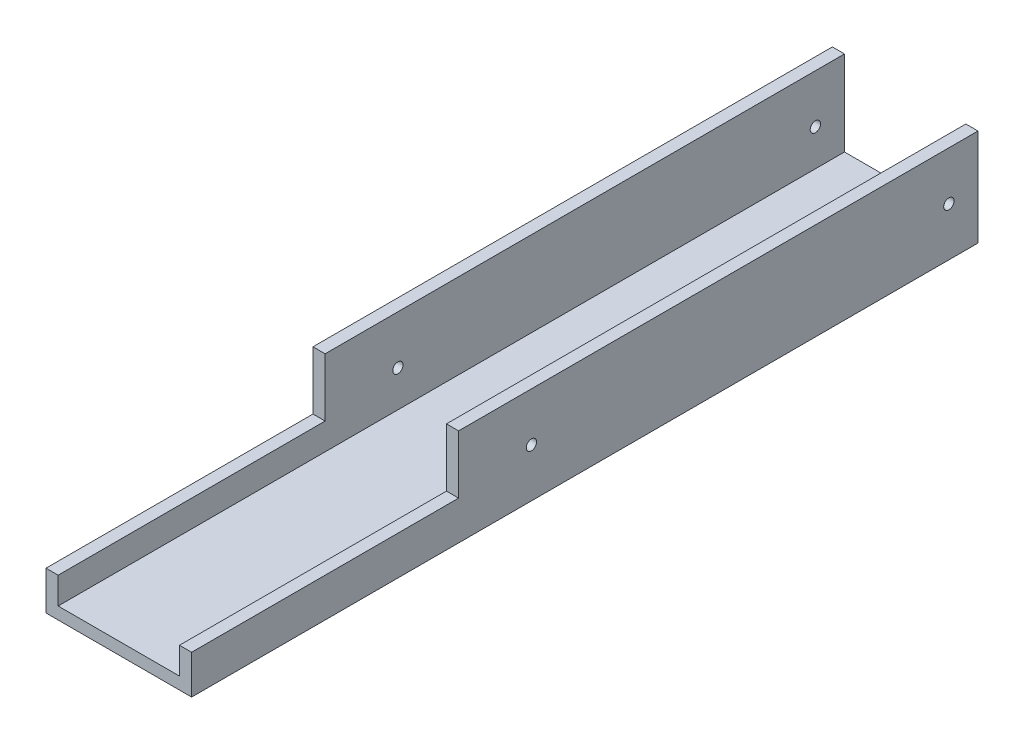
ISO-10303-21;
HEADER;
FILE_DESCRIPTION(('STEP AP214'),'2;1');
FILE_NAME('part.step','',(''),(''),'','','');
FILE_SCHEMA(('AUTOMOTIVE_DESIGN { 1 0 10303 214 1 1 1 1 }'));
ENDSEC;
DATA;
#1=APPLICATION_CONTEXT('core data for automotive mechanical design processes');
#2=APPLICATION_PROTOCOL_DEFINITION('international standard','automotive_design',2000,#1);
#3=PRODUCT_CONTEXT('',#1,'mechanical');
#4=PRODUCT('Part','Part','',(#3));
#5=PRODUCT_RELATED_PRODUCT_CATEGORY('part','',(#4));
#6=PRODUCT_DEFINITION_FORMATION('','',#4);
#7=PRODUCT_DEFINITION_CONTEXT('part definition',#1,'design');
#8=PRODUCT_DEFINITION('design','',#6,#7);
#9=PRODUCT_DEFINITION_SHAPE('','',#8);
#10=(LENGTH_UNIT() NAMED_UNIT(*) SI_UNIT(.MILLI.,.METRE.));
#11=(NAMED_UNIT(*) PLANE_ANGLE_UNIT() SI_UNIT($,.RADIAN.));
#12=(NAMED_UNIT(*) SI_UNIT($,.STERADIAN.) SOLID_ANGLE_UNIT());
#13=UNCERTAINTY_MEASURE_WITH_UNIT(LENGTH_MEASURE(1.E-05),#10,'distance_accuracy_value','');
#14=(GEOMETRIC_REPRESENTATION_CONTEXT(3) GLOBAL_UNCERTAINTY_ASSIGNED_CONTEXT((#13)) GLOBAL_UNIT_ASSIGNED_CONTEXT((#10,
#11,#12)) REPRESENTATION_CONTEXT('',''));
#15=CARTESIAN_POINT('',(0.,0.,0.));
#16=DIRECTION('',(0.,0.,1.));
#17=DIRECTION('',(1.,0.,0.));
#18=AXIS2_PLACEMENT_3D('',#15,#16,#17);
#19=CARTESIAN_POINT('',(-15.875,12.7,609.6));
#20=DIRECTION('',(0.,-1.,0.));
#21=DIRECTION('',(0.,0.,-1.));
#22=AXIS2_PLACEMENT_3D('',#19,#20,#21);
#23=PLANE('',#22);
#24=DIRECTION('',(0.,0.,-1.));
#25=VECTOR('',#24,1.);
#26=CARTESIAN_POINT('',(-19.05,12.7,609.6));
#27=LINE('',#26,#25);
#28=CARTESIAN_POINT('',(-19.05,12.7,-473.71));
#29=VERTEX_POINT('',#28);
#30=CARTESIAN_POINT('',(-19.05,12.7,-609.6));
#31=VERTEX_POINT('',#30);
#32=EDGE_CURVE('E175',#29,#31,#27,.T.);
#33=ORIENTED_EDGE('',*,*,#32,.F.);
#34=DIRECTION('',(-1.,0.,0.));
#35=VECTOR('',#34,1.);
#36=CARTESIAN_POINT('',(19.05,12.7,-473.71));
#37=LINE('',#36,#35);
#38=CARTESIAN_POINT('',(-15.875,12.7,-473.71));
#39=VERTEX_POINT('',#38);
#40=EDGE_CURVE('E156',#39,#29,#37,.T.);
#41=ORIENTED_EDGE('',*,*,#40,.F.);
#42=DIRECTION('',(0.,0.,-1.));
#43=VECTOR('',#42,1.);
#44=CARTESIAN_POINT('',(-15.875,12.7,609.6));
#45=LINE('',#44,#43);
#46=CARTESIAN_POINT('',(-15.875,12.7,-609.6));
#47=VERTEX_POINT('',#46);
#48=EDGE_CURVE('E250',#39,#47,#45,.T.);
#49=ORIENTED_EDGE('',*,*,#48,.T.);
#50=DIRECTION('',(-1.,0.,0.));
#51=VECTOR('',#50,1.);
#52=CARTESIAN_POINT('',(-15.875,12.7,-609.6));
#53=LINE('',#52,#51);
#54=EDGE_CURVE('E222',#47,#31,#53,.T.);
#55=ORIENTED_EDGE('',*,*,#54,.T.);
#56=EDGE_LOOP('',(#33,#41,#49,#55));
#57=FACE_BOUND('',#56,.T.);
#58=ADVANCED_FACE('F44',(#57),#23,.F.);
#59=CARTESIAN_POINT('',(-19.05,12.7,609.6));
#60=DIRECTION('',(1.,0.,0.));
#61=DIRECTION('',(0.,1.,0.));
#62=AXIS2_PLACEMENT_3D('',#59,#60,#61);
#63=PLANE('',#62);
#64=CARTESIAN_POINT('',(-19.05,0.,-492.76));
#65=DIRECTION('',(-1.,0.,0.));
#66=DIRECTION('',(0.,0.,1.));
#67=AXIS2_PLACEMENT_3D('',#64,#65,#66);
#68=CIRCLE('',#67,1.35255);
#69=CARTESIAN_POINT('',(-19.05,0.,-491.40745));
#70=VERTEX_POINT('',#69);
#71=EDGE_CURVE('E293',#70,#70,#68,.T.);
#72=ORIENTED_EDGE('',*,*,#71,.F.);
#73=EDGE_LOOP('',(#72));
#74=FACE_BOUND('',#73,.T.);
#75=CARTESIAN_POINT('',(-19.05,0.,-601.98));
#76=DIRECTION('',(-1.,0.,0.));
#77=DIRECTION('',(0.,0.,1.));
#78=AXIS2_PLACEMENT_3D('',#75,#76,#77);
#79=CIRCLE('',#78,1.35254999999999);
#80=CARTESIAN_POINT('',(-19.05,0.,-600.62745));
#81=VERTEX_POINT('',#80);
#82=EDGE_CURVE('E303',#81,#81,#79,.T.);
#83=ORIENTED_EDGE('',*,*,#82,.F.);
#84=EDGE_LOOP('',(#83));
#85=FACE_BOUND('',#84,.T.);
#86=DIRECTION('',(0.,-1.,0.));
#87=VECTOR('',#86,1.);
#88=CARTESIAN_POINT('',(-19.05,-12.7,-403.86));
#89=LINE('',#88,#87);
#90=CARTESIAN_POINT('',(-19.05,-2.54,-403.86));
#91=VERTEX_POINT('',#90);
#92=CARTESIAN_POINT('',(-19.05,-12.7,-403.86));
#93=VERTEX_POINT('',#92);
#94=EDGE_CURVE('E189',#91,#93,#89,.T.);
#95=ORIENTED_EDGE('',*,*,#94,.F.);
#96=DIRECTION('',(0.,0.,-1.));
#97=VECTOR('',#96,1.);
#98=CARTESIAN_POINT('',(-19.05,-2.53999999999988,609.6));
#99=LINE('',#98,#97);
#100=CARTESIAN_POINT('',(-19.05,-2.54000000000002,-473.71));
#101=VERTEX_POINT('',#100);
#102=EDGE_CURVE('E67',#91,#101,#99,.T.);
#103=ORIENTED_EDGE('',*,*,#102,.T.);
#104=DIRECTION('',(0.,1.,0.));
#105=VECTOR('',#104,1.);
#106=CARTESIAN_POINT('',(-19.05,12.7,-473.71));
#107=LINE('',#106,#105);
#108=EDGE_CURVE('E290',#101,#29,#107,.T.);
#109=ORIENTED_EDGE('',*,*,#108,.T.);
#110=ORIENTED_EDGE('',*,*,#32,.T.);
#111=DIRECTION('',(0.,-1.,0.));
#112=VECTOR('',#111,1.);
#113=CARTESIAN_POINT('',(-19.05,12.7,-609.6));
#114=LINE('',#113,#112);
#115=CARTESIAN_POINT('',(-19.05,-12.7,-609.6));
#116=VERTEX_POINT('',#115);
#117=EDGE_CURVE('E226',#31,#116,#114,.T.);
#118=ORIENTED_EDGE('',*,*,#117,.T.);
#119=DIRECTION('',(0.,0.,-1.));
#120=VECTOR('',#119,1.);
#121=CARTESIAN_POINT('',(-19.05,-12.7,609.6));
#122=LINE('',#121,#120);
#123=EDGE_CURVE('E167',#93,#116,#122,.T.);
#124=ORIENTED_EDGE('',*,*,#123,.F.);
#125=EDGE_LOOP('',(#95,#103,#109,#110,#118,#124));
#126=FACE_BOUND('',#125,.T.);
#127=ADVANCED_FACE('F196',(#74,#85,#126),#63,.F.);
#128=CARTESIAN_POINT('',(-19.05,-12.7,609.6));
#129=DIRECTION('',(0.,1.,0.));
#130=DIRECTION('',(0.,0.,1.));
#131=AXIS2_PLACEMENT_3D('',#128,#129,#130);
#132=PLANE('',#131);
#133=DIRECTION('',(0.,0.,-1.));
#134=VECTOR('',#133,1.);
#135=CARTESIAN_POINT('',(19.05,-12.7,609.6));
#136=LINE('',#135,#134);
#137=CARTESIAN_POINT('',(19.05,-12.7,-403.86));
#138=VERTEX_POINT('',#137);
#139=CARTESIAN_POINT('',(19.05,-12.7,-609.6));
#140=VERTEX_POINT('',#139);
#141=EDGE_CURVE('E163',#138,#140,#136,.T.);
#142=ORIENTED_EDGE('',*,*,#141,.F.);
#143=DIRECTION('',(1.,0.,0.));
#144=VECTOR('',#143,1.);
#145=CARTESIAN_POINT('',(19.05,-12.7,-403.86));
#146=LINE('',#145,#144);
#147=EDGE_CURVE('E200',#93,#138,#146,.T.);
#148=ORIENTED_EDGE('',*,*,#147,.F.);
#149=ORIENTED_EDGE('',*,*,#123,.T.);
#150=DIRECTION('',(1.,0.,0.));
#151=VECTOR('',#150,1.);
#152=CARTESIAN_POINT('',(-19.05,-12.7,-609.6));
#153=LINE('',#152,#151);
#154=EDGE_CURVE('E229',#116,#140,#153,.T.);
#155=ORIENTED_EDGE('',*,*,#154,.T.);
#156=EDGE_LOOP('',(#142,#148,#149,#155));
#157=FACE_BOUND('',#156,.T.);
#158=ADVANCED_FACE('F336',(#157),#132,.F.);
#159=CARTESIAN_POINT('',(19.05,-12.7,609.6));
#160=DIRECTION('',(-1.,0.,0.));
#161=DIRECTION('',(0.,-1.,0.));
#162=AXIS2_PLACEMENT_3D('',#159,#160,#161);
#163=PLANE('',#162);
#164=CARTESIAN_POINT('',(19.05,0.,-492.76));
#165=DIRECTION('',(-1.,0.,0.));
#166=DIRECTION('',(0.,0.,1.));
#167=AXIS2_PLACEMENT_3D('',#164,#165,#166);
#168=CIRCLE('',#167,1.35254999999999);
#169=CARTESIAN_POINT('',(19.05,0.,-491.40745));
#170=VERTEX_POINT('',#169);
#171=EDGE_CURVE('E182',#170,#170,#168,.T.);
#172=ORIENTED_EDGE('',*,*,#171,.T.);
#173=EDGE_LOOP('',(#172));
#174=FACE_BOUND('',#173,.T.);
#175=CARTESIAN_POINT('',(19.05,0.,-601.98));
#176=DIRECTION('',(-1.,0.,0.));
#177=DIRECTION('',(0.,0.,1.));
#178=AXIS2_PLACEMENT_3D('',#175,#176,#177);
#179=CIRCLE('',#178,1.35254999999999);
#180=CARTESIAN_POINT('',(19.05,0.,-600.62745));
#181=VERTEX_POINT('',#180);
#182=EDGE_CURVE('E307',#181,#181,#179,.T.);
#183=ORIENTED_EDGE('',*,*,#182,.T.);
#184=EDGE_LOOP('',(#183));
#185=FACE_BOUND('',#184,.T.);
#186=DIRECTION('',(0.,-1.,0.));
#187=VECTOR('',#186,1.);
#188=CARTESIAN_POINT('',(19.05,12.7,-473.71));
#189=LINE('',#188,#187);
#190=CARTESIAN_POINT('',(19.05,12.7,-473.71));
#191=VERTEX_POINT('',#190);
#192=CARTESIAN_POINT('',(19.05,-2.54000000000001,-473.71));
#193=VERTEX_POINT('',#192);
#194=EDGE_CURVE('E134',#191,#193,#189,.T.);
#195=ORIENTED_EDGE('',*,*,#194,.T.);
#196=DIRECTION('',(0.,0.,1.));
#197=VECTOR('',#196,1.);
#198=CARTESIAN_POINT('',(19.05,-2.54,-403.86));
#199=LINE('',#198,#197);
#200=CARTESIAN_POINT('',(19.05,-2.54,-403.86));
#201=VERTEX_POINT('',#200);
#202=EDGE_CURVE('E145',#193,#201,#199,.T.);
#203=ORIENTED_EDGE('',*,*,#202,.T.);
#204=DIRECTION('',(0.,1.,0.));
#205=VECTOR('',#204,1.);
#206=CARTESIAN_POINT('',(19.05,12.7,-403.86));
#207=LINE('',#206,#205);
#208=EDGE_CURVE('E205',#138,#201,#207,.T.);
#209=ORIENTED_EDGE('',*,*,#208,.F.);
#210=ORIENTED_EDGE('',*,*,#141,.T.);
#211=DIRECTION('',(0.,1.,0.));
#212=VECTOR('',#211,1.);
#213=CARTESIAN_POINT('',(19.05,-12.7,-609.6));
#214=LINE('',#213,#212);
#215=CARTESIAN_POINT('',(19.05,12.7,-609.6));
#216=VERTEX_POINT('',#215);
#217=EDGE_CURVE('E160',#140,#216,#214,.T.);
#218=ORIENTED_EDGE('',*,*,#217,.T.);
#219=DIRECTION('',(0.,0.,-1.));
#220=VECTOR('',#219,1.);
#221=CARTESIAN_POINT('',(19.05,12.7,609.6));
#222=LINE('',#221,#220);
#223=EDGE_CURVE('E151',#191,#216,#222,.T.);
#224=ORIENTED_EDGE('',*,*,#223,.F.);
#225=EDGE_LOOP('',(#195,#203,#209,#210,#218,#224));
#226=FACE_BOUND('',#225,.T.);
#227=ADVANCED_FACE('F158',(#174,#185,#226),#163,.F.);
#228=CARTESIAN_POINT('',(19.05,12.7,609.6));
#229=DIRECTION('',(0.,-1.,0.));
#230=DIRECTION('',(0.,0.,-1.));
#231=AXIS2_PLACEMENT_3D('',#228,#229,#230);
#232=PLANE('',#231);
#233=DIRECTION('',(0.,0.,-1.));
#234=VECTOR('',#233,1.);
#235=CARTESIAN_POINT('',(15.875,12.7,609.6));
#236=LINE('',#235,#234);
#237=CARTESIAN_POINT('',(15.875,12.7,-473.71));
#238=VERTEX_POINT('',#237);
#239=CARTESIAN_POINT('',(15.875,12.7,-609.6));
#240=VERTEX_POINT('',#239);
#241=EDGE_CURVE('E153',#238,#240,#236,.T.);
#242=ORIENTED_EDGE('',*,*,#241,.F.);
#243=EDGE_CURVE('E137',#191,#238,#37,.T.);
#244=ORIENTED_EDGE('',*,*,#243,.F.);
#245=ORIENTED_EDGE('',*,*,#223,.T.);
#246=DIRECTION('',(-1.,0.,0.));
#247=VECTOR('',#246,1.);
#248=CARTESIAN_POINT('',(19.05,12.7,-609.6));
#249=LINE('',#248,#247);
#250=EDGE_CURVE('E235',#216,#240,#249,.T.);
#251=ORIENTED_EDGE('',*,*,#250,.T.);
#252=EDGE_LOOP('',(#242,#244,#245,#251));
#253=FACE_BOUND('',#252,.T.);
#254=ADVANCED_FACE('F149',(#253),#232,.F.);
#255=CARTESIAN_POINT('',(15.875,12.7,609.6));
#256=DIRECTION('',(1.,0.,0.));
#257=DIRECTION('',(0.,1.,0.));
#258=AXIS2_PLACEMENT_3D('',#255,#256,#257);
#259=PLANE('',#258);
#260=CARTESIAN_POINT('',(15.875,0.,-492.76));
#261=DIRECTION('',(1.,0.,0.));
#262=DIRECTION('',(0.,1.,0.));
#263=AXIS2_PLACEMENT_3D('',#260,#261,#262);
#264=CIRCLE('',#263,1.35255);
#265=CARTESIAN_POINT('',(15.875,1.35254999999999,-492.76));
#266=VERTEX_POINT('',#265);
#267=EDGE_CURVE('E181',#266,#266,#264,.T.);
#268=ORIENTED_EDGE('',*,*,#267,.T.);
#269=EDGE_LOOP('',(#268));
#270=FACE_BOUND('',#269,.T.);
#271=CARTESIAN_POINT('',(15.875,0.,-601.98));
#272=DIRECTION('',(1.,0.,0.));
#273=DIRECTION('',(0.,1.,0.));
#274=AXIS2_PLACEMENT_3D('',#271,#272,#273);
#275=CIRCLE('',#274,1.35254999999999);
#276=CARTESIAN_POINT('',(15.875,1.35254999999999,-601.98));
#277=VERTEX_POINT('',#276);
#278=EDGE_CURVE('E201',#277,#277,#275,.T.);
#279=ORIENTED_EDGE('',*,*,#278,.T.);
#280=EDGE_LOOP('',(#279));
#281=FACE_BOUND('',#280,.T.);
#282=DIRECTION('',(0.,-1.,0.));
#283=VECTOR('',#282,1.);
#284=CARTESIAN_POINT('',(15.875,-9.525,-403.86));
#285=LINE('',#284,#283);
#286=CARTESIAN_POINT('',(15.875,-2.54,-403.86));
#287=VERTEX_POINT('',#286);
#288=CARTESIAN_POINT('',(15.875,-9.525,-403.86));
#289=VERTEX_POINT('',#288);
#290=EDGE_CURVE('E214',#287,#289,#285,.T.);
#291=ORIENTED_EDGE('',*,*,#290,.F.);
#292=DIRECTION('',(0.,0.,-1.));
#293=VECTOR('',#292,1.);
#294=CARTESIAN_POINT('',(15.875,-2.53999999999988,609.6));
#295=LINE('',#294,#293);
#296=CARTESIAN_POINT('',(15.875,-2.54000000000001,-473.71));
#297=VERTEX_POINT('',#296);
#298=EDGE_CURVE('E59',#287,#297,#295,.T.);
#299=ORIENTED_EDGE('',*,*,#298,.T.);
#300=DIRECTION('',(0.,1.,0.));
#301=VECTOR('',#300,1.);
#302=CARTESIAN_POINT('',(15.875,12.7,-473.71));
#303=LINE('',#302,#301);
#304=EDGE_CURVE('E287',#297,#238,#303,.T.);
#305=ORIENTED_EDGE('',*,*,#304,.T.);
#306=ORIENTED_EDGE('',*,*,#241,.T.);
#307=DIRECTION('',(0.,-1.,0.));
#308=VECTOR('',#307,1.);
#309=CARTESIAN_POINT('',(15.875,12.7,-609.6));
#310=LINE('',#309,#308);
#311=CARTESIAN_POINT('',(15.875,-9.525,-609.6));
#312=VERTEX_POINT('',#311);
#313=EDGE_CURVE('E238',#240,#312,#310,.T.);
#314=ORIENTED_EDGE('',*,*,#313,.T.);
#315=DIRECTION('',(0.,0.,-1.));
#316=VECTOR('',#315,1.);
#317=CARTESIAN_POINT('',(15.875,-9.525,609.6));
#318=LINE('',#317,#316);
#319=EDGE_CURVE('E169',#289,#312,#318,.T.);
#320=ORIENTED_EDGE('',*,*,#319,.F.);
#321=EDGE_LOOP('',(#291,#299,#305,#306,#314,#320));
#322=FACE_BOUND('',#321,.T.);
#323=ADVANCED_FACE('F266',(#270,#281,#322),#259,.F.);
#324=CARTESIAN_POINT('',(15.875,-9.525,609.6));
#325=DIRECTION('',(0.,-1.,0.));
#326=DIRECTION('',(1.,0.,0.));
#327=AXIS2_PLACEMENT_3D('',#324,#325,#326);
#328=PLANE('',#327);
#329=DIRECTION('',(0.,0.,-1.));
#330=VECTOR('',#329,1.);
#331=CARTESIAN_POINT('',(-15.875,-9.52500000000001,609.6));
#332=LINE('',#331,#330);
#333=CARTESIAN_POINT('',(-15.875,-9.52500000000001,-403.86));
#334=VERTEX_POINT('',#333);
#335=CARTESIAN_POINT('',(-15.875,-9.52500000000001,-609.6));
#336=VERTEX_POINT('',#335);
#337=EDGE_CURVE('E253',#334,#336,#332,.T.);
#338=ORIENTED_EDGE('',*,*,#337,.F.);
#339=DIRECTION('',(-1.,0.,0.));
#340=VECTOR('',#339,1.);
#341=CARTESIAN_POINT('',(-15.875,-9.52500000000001,-403.86));
#342=LINE('',#341,#340);
#343=EDGE_CURVE('E217',#289,#334,#342,.T.);
#344=ORIENTED_EDGE('',*,*,#343,.F.);
#345=ORIENTED_EDGE('',*,*,#319,.T.);
#346=DIRECTION('',(-1.,0.,0.));
#347=VECTOR('',#346,1.);
#348=CARTESIAN_POINT('',(15.875,-9.525,-609.6));
#349=LINE('',#348,#347);
#350=EDGE_CURVE('E242',#312,#336,#349,.T.);
#351=ORIENTED_EDGE('',*,*,#350,.T.);
#352=EDGE_LOOP('',(#338,#344,#345,#351));
#353=FACE_BOUND('',#352,.T.);
#354=ADVANCED_FACE('F260',(#353),#328,.F.);
#355=CARTESIAN_POINT('',(-15.875,-9.52500000000001,609.6));
#356=DIRECTION('',(-1.,0.,0.));
#357=DIRECTION('',(0.,0.,1.));
#358=AXIS2_PLACEMENT_3D('',#355,#356,#357);
#359=PLANE('',#358);
#360=CARTESIAN_POINT('',(-15.875,0.,-492.76));
#361=DIRECTION('',(-1.,0.,0.));
#362=DIRECTION('',(0.,0.,1.));
#363=AXIS2_PLACEMENT_3D('',#360,#361,#362);
#364=CIRCLE('',#363,1.35255);
#365=CARTESIAN_POINT('',(-15.875,0.,-491.40745));
#366=VERTEX_POINT('',#365);
#367=EDGE_CURVE('E178',#366,#366,#364,.T.);
#368=ORIENTED_EDGE('',*,*,#367,.T.);
#369=EDGE_LOOP('',(#368));
#370=FACE_BOUND('',#369,.T.);
#371=CARTESIAN_POINT('',(-15.875,0.,-601.98));
#372=DIRECTION('',(-1.,0.,0.));
#373=DIRECTION('',(0.,0.,1.));
#374=AXIS2_PLACEMENT_3D('',#371,#372,#373);
#375=CIRCLE('',#374,1.35254999999999);
#376=CARTESIAN_POINT('',(-15.875,0.,-600.62745));
#377=VERTEX_POINT('',#376);
#378=EDGE_CURVE('E208',#377,#377,#375,.T.);
#379=ORIENTED_EDGE('',*,*,#378,.T.);
#380=EDGE_LOOP('',(#379));
#381=FACE_BOUND('',#380,.T.);
#382=DIRECTION('',(0.,-1.,0.));
#383=VECTOR('',#382,1.);
#384=CARTESIAN_POINT('',(-15.875,-9.52500000000001,-473.71));
#385=LINE('',#384,#383);
#386=CARTESIAN_POINT('',(-15.875,-2.54000000000001,-473.71));
#387=VERTEX_POINT('',#386);
#388=EDGE_CURVE('E11',#39,#387,#385,.T.);
#389=ORIENTED_EDGE('',*,*,#388,.T.);
#390=DIRECTION('',(0.,0.,1.));
#391=VECTOR('',#390,1.);
#392=CARTESIAN_POINT('',(-15.875,-2.53999999999988,609.6));
#393=LINE('',#392,#391);
#394=CARTESIAN_POINT('',(-15.875,-2.54000000000001,-403.86));
#395=VERTEX_POINT('',#394);
#396=EDGE_CURVE('E274',#387,#395,#393,.T.);
#397=ORIENTED_EDGE('',*,*,#396,.T.);
#398=DIRECTION('',(0.,1.,0.));
#399=VECTOR('',#398,1.);
#400=CARTESIAN_POINT('',(-15.875,12.7,-403.86));
#401=LINE('',#400,#399);
#402=EDGE_CURVE('E192',#334,#395,#401,.T.);
#403=ORIENTED_EDGE('',*,*,#402,.F.);
#404=ORIENTED_EDGE('',*,*,#337,.T.);
#405=DIRECTION('',(0.,1.,0.));
#406=VECTOR('',#405,1.);
#407=CARTESIAN_POINT('',(-15.875,-9.52500000000001,-609.6));
#408=LINE('',#407,#406);
#409=EDGE_CURVE('E246',#336,#47,#408,.T.);
#410=ORIENTED_EDGE('',*,*,#409,.T.);
#411=ORIENTED_EDGE('',*,*,#48,.F.);
#412=EDGE_LOOP('',(#389,#397,#403,#404,#410,#411));
#413=FACE_BOUND('',#412,.T.);
#414=ADVANCED_FACE('F273',(#370,#381,#413),#359,.F.);
#415=CARTESIAN_POINT('',(0.,0.,-609.6));
#416=DIRECTION('',(0.,0.,1.));
#417=DIRECTION('',(1.,0.,0.));
#418=AXIS2_PLACEMENT_3D('',#415,#416,#417);
#419=PLANE('',#418);
#420=ORIENTED_EDGE('',*,*,#54,.F.);
#421=ORIENTED_EDGE('',*,*,#409,.F.);
#422=ORIENTED_EDGE('',*,*,#350,.F.);
#423=ORIENTED_EDGE('',*,*,#313,.F.);
#424=ORIENTED_EDGE('',*,*,#250,.F.);
#425=ORIENTED_EDGE('',*,*,#217,.F.);
#426=ORIENTED_EDGE('',*,*,#154,.F.);
#427=ORIENTED_EDGE('',*,*,#117,.F.);
#428=EDGE_LOOP('',(#420,#421,#422,#423,#424,#425,#426,#427));
#429=FACE_BOUND('',#428,.T.);
#430=ADVANCED_FACE('F269',(#429),#419,.F.);
#431=CARTESIAN_POINT('',(0.,0.,-403.86));
#432=DIRECTION('',(0.,0.,-1.));
#433=DIRECTION('',(-1.,0.,0.));
#434=AXIS2_PLACEMENT_3D('',#431,#432,#433);
#435=PLANE('',#434);
#436=ORIENTED_EDGE('',*,*,#208,.T.);
#437=DIRECTION('',(-1.,0.,0.));
#438=VECTOR('',#437,1.);
#439=CARTESIAN_POINT('',(19.05,-2.54,-403.86));
#440=LINE('',#439,#438);
#441=EDGE_CURVE('E277',#201,#287,#440,.T.);
#442=ORIENTED_EDGE('',*,*,#441,.T.);
#443=ORIENTED_EDGE('',*,*,#290,.T.);
#444=ORIENTED_EDGE('',*,*,#343,.T.);
#445=ORIENTED_EDGE('',*,*,#402,.T.);
#446=DIRECTION('',(-1.,0.,0.));
#447=VECTOR('',#446,1.);
#448=CARTESIAN_POINT('',(0.,-2.54,-403.86));
#449=LINE('',#448,#447);
#450=EDGE_CURVE('E52',#395,#91,#449,.T.);
#451=ORIENTED_EDGE('',*,*,#450,.T.);
#452=ORIENTED_EDGE('',*,*,#94,.T.);
#453=ORIENTED_EDGE('',*,*,#147,.T.);
#454=EDGE_LOOP('',(#436,#442,#443,#444,#445,#451,#452,#453));
#455=FACE_BOUND('',#454,.T.);
#456=ADVANCED_FACE('F188',(#455),#435,.F.);
#457=CARTESIAN_POINT('',(-19.05,0.,-601.98));
#458=DIRECTION('',(-1.,0.,0.));
#459=DIRECTION('',(0.,0.,1.));
#460=AXIS2_PLACEMENT_3D('',#457,#458,#459);
#461=CYLINDRICAL_SURFACE('',#460,1.35254999999999);
#462=ORIENTED_EDGE('',*,*,#182,.F.);
#463=EDGE_LOOP('',(#462));
#464=FACE_BOUND('',#463,.T.);
#465=ORIENTED_EDGE('',*,*,#278,.F.);
#466=EDGE_LOOP('',(#465));
#467=FACE_BOUND('',#466,.T.);
#468=ADVANCED_FACE('F318',(#464,#467),#461,.F.);
#469=ORIENTED_EDGE('',*,*,#82,.T.);
#470=EDGE_LOOP('',(#469));
#471=FACE_BOUND('',#470,.T.);
#472=ORIENTED_EDGE('',*,*,#378,.F.);
#473=EDGE_LOOP('',(#472));
#474=FACE_BOUND('',#473,.T.);
#475=ADVANCED_FACE('F315',(#471,#474),#461,.F.);
#476=CARTESIAN_POINT('',(-19.05,0.,-492.76));
#477=DIRECTION('',(-1.,0.,0.));
#478=DIRECTION('',(0.,0.,1.));
#479=AXIS2_PLACEMENT_3D('',#476,#477,#478);
#480=CYLINDRICAL_SURFACE('',#479,1.35255);
#481=ORIENTED_EDGE('',*,*,#71,.T.);
#482=EDGE_LOOP('',(#481));
#483=FACE_BOUND('',#482,.T.);
#484=ORIENTED_EDGE('',*,*,#367,.F.);
#485=EDGE_LOOP('',(#484));
#486=FACE_BOUND('',#485,.T.);
#487=ADVANCED_FACE('F317',(#483,#486),#480,.F.);
#488=ORIENTED_EDGE('',*,*,#171,.F.);
#489=EDGE_LOOP('',(#488));
#490=FACE_BOUND('',#489,.T.);
#491=ORIENTED_EDGE('',*,*,#267,.F.);
#492=EDGE_LOOP('',(#491));
#493=FACE_BOUND('',#492,.T.);
#494=ADVANCED_FACE('F325',(#490,#493),#480,.F.);
#495=CARTESIAN_POINT('',(19.05,-2.54,-403.86));
#496=DIRECTION('',(0.,-1.,0.));
#497=DIRECTION('',(1.,0.,0.));
#498=AXIS2_PLACEMENT_3D('',#495,#496,#497);
#499=PLANE('',#498);
#500=ORIENTED_EDGE('',*,*,#450,.F.);
#501=ORIENTED_EDGE('',*,*,#396,.F.);
#502=DIRECTION('',(-1.,0.,0.));
#503=VECTOR('',#502,1.);
#504=CARTESIAN_POINT('',(19.05,-2.54000000000001,-473.71));
#505=LINE('',#504,#503);
#506=EDGE_CURVE('E155',#387,#101,#505,.T.);
#507=ORIENTED_EDGE('',*,*,#506,.T.);
#508=ORIENTED_EDGE('',*,*,#102,.F.);
#509=EDGE_LOOP('',(#500,#501,#507,#508));
#510=FACE_BOUND('',#509,.T.);
#511=ADVANCED_FACE('F349',(#510),#499,.F.);
#512=CARTESIAN_POINT('',(19.05,12.7,-473.71));
#513=DIRECTION('',(0.,0.,-1.));
#514=DIRECTION('',(-1.,0.,0.));
#515=AXIS2_PLACEMENT_3D('',#512,#513,#514);
#516=PLANE('',#515);
#517=ORIENTED_EDGE('',*,*,#506,.F.);
#518=ORIENTED_EDGE('',*,*,#388,.F.);
#519=ORIENTED_EDGE('',*,*,#40,.T.);
#520=ORIENTED_EDGE('',*,*,#108,.F.);
#521=EDGE_LOOP('',(#517,#518,#519,#520));
#522=FACE_BOUND('',#521,.T.);
#523=ADVANCED_FACE('F351',(#522),#516,.F.);
#524=EDGE_CURVE('E139',#193,#297,#505,.T.);
#525=ORIENTED_EDGE('',*,*,#524,.F.);
#526=ORIENTED_EDGE('',*,*,#194,.F.);
#527=ORIENTED_EDGE('',*,*,#243,.T.);
#528=ORIENTED_EDGE('',*,*,#304,.F.);
#529=EDGE_LOOP('',(#525,#526,#527,#528));
#530=FACE_BOUND('',#529,.T.);
#531=ADVANCED_FACE('F136',(#530),#516,.F.);
#532=ORIENTED_EDGE('',*,*,#441,.F.);
#533=ORIENTED_EDGE('',*,*,#202,.F.);
#534=ORIENTED_EDGE('',*,*,#524,.T.);
#535=ORIENTED_EDGE('',*,*,#298,.F.);
#536=EDGE_LOOP('',(#532,#533,#534,#535));
#537=FACE_BOUND('',#536,.T.);
#538=ADVANCED_FACE('F358',(#537),#499,.F.);
#539=CLOSED_SHELL('',(#58,#127,#158,#227,#254,#323,#354,#414,#430,#456,#468,#475,#487,#494,#511,
#523,#531,#538));
#540=MANIFOLD_SOLID_BREP('B2',#539);
#541=ADVANCED_BREP_SHAPE_REPRESENTATION('',(#18,#540),#14);
#542=SHAPE_DEFINITION_REPRESENTATION(#9,#541);
ENDSEC;
END-ISO-10303-21;
